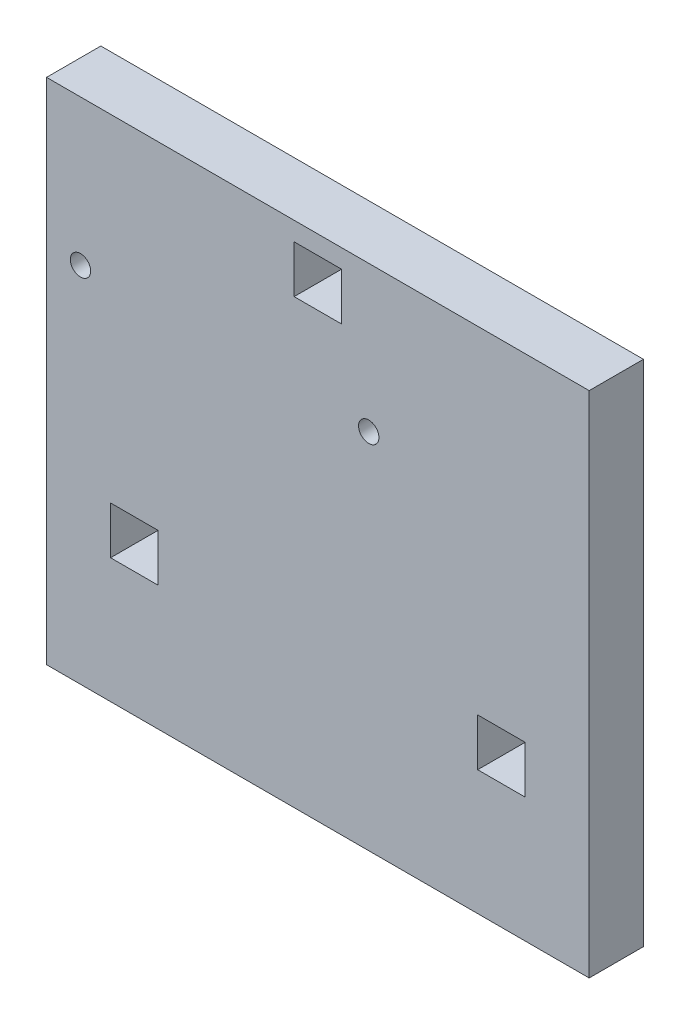
ISO-10303-21;
HEADER;
FILE_DESCRIPTION(('STEP AP214'),'2;1');
FILE_NAME('part.step','',(''),(''),'','','');
FILE_SCHEMA(('AUTOMOTIVE_DESIGN { 1 0 10303 214 1 1 1 1 }'));
ENDSEC;
DATA;
#1=APPLICATION_CONTEXT('core data for automotive mechanical design processes');
#2=APPLICATION_PROTOCOL_DEFINITION('international standard','automotive_design',2000,#1);
#3=PRODUCT_CONTEXT('',#1,'mechanical');
#4=PRODUCT('Part','Part','',(#3));
#5=PRODUCT_RELATED_PRODUCT_CATEGORY('part','',(#4));
#6=PRODUCT_DEFINITION_FORMATION('','',#4);
#7=PRODUCT_DEFINITION_CONTEXT('part definition',#1,'design');
#8=PRODUCT_DEFINITION('design','',#6,#7);
#9=PRODUCT_DEFINITION_SHAPE('','',#8);
#10=(LENGTH_UNIT() NAMED_UNIT(*) SI_UNIT(.MILLI.,.METRE.));
#11=(NAMED_UNIT(*) PLANE_ANGLE_UNIT() SI_UNIT($,.RADIAN.));
#12=(NAMED_UNIT(*) SI_UNIT($,.STERADIAN.) SOLID_ANGLE_UNIT());
#13=UNCERTAINTY_MEASURE_WITH_UNIT(LENGTH_MEASURE(1.E-05),#10,'distance_accuracy_value','');
#14=(GEOMETRIC_REPRESENTATION_CONTEXT(3) GLOBAL_UNCERTAINTY_ASSIGNED_CONTEXT((#13)) GLOBAL_UNIT_ASSIGNED_CONTEXT((#10,
#11,#12)) REPRESENTATION_CONTEXT('',''));
#15=CARTESIAN_POINT('',(0.,0.,0.));
#16=DIRECTION('',(0.,0.,1.));
#17=DIRECTION('',(1.,0.,0.));
#18=AXIS2_PLACEMENT_3D('',#15,#16,#17);
#19=CARTESIAN_POINT('',(0.,0.,16.));
#20=DIRECTION('',(-1.,0.,0.));
#21=DIRECTION('',(0.,-1.,0.));
#22=AXIS2_PLACEMENT_3D('',#19,#20,#21);
#23=PLANE('',#22);
#24=DIRECTION('',(0.,1.,0.));
#25=VECTOR('',#24,1.);
#26=CARTESIAN_POINT('',(0.,0.,0.));
#27=LINE('',#26,#25);
#28=CARTESIAN_POINT('',(0.,-150.,0.));
#29=VERTEX_POINT('',#28);
#30=CARTESIAN_POINT('',(0.,0.,0.));
#31=VERTEX_POINT('',#30);
#32=EDGE_CURVE('E185',#29,#31,#27,.T.);
#33=ORIENTED_EDGE('',*,*,#32,.T.);
#34=DIRECTION('',(0.,0.,-1.));
#35=VECTOR('',#34,1.);
#36=CARTESIAN_POINT('',(0.,0.,16.));
#37=LINE('',#36,#35);
#38=CARTESIAN_POINT('',(0.,0.,16.));
#39=VERTEX_POINT('',#38);
#40=EDGE_CURVE('E11',#39,#31,#37,.T.);
#41=ORIENTED_EDGE('',*,*,#40,.F.);
#42=DIRECTION('',(0.,1.,0.));
#43=VECTOR('',#42,1.);
#44=CARTESIAN_POINT('',(0.,0.,16.));
#45=LINE('',#44,#43);
#46=CARTESIAN_POINT('',(0.,-150.,16.));
#47=VERTEX_POINT('',#46);
#48=EDGE_CURVE('E251',#47,#39,#45,.T.);
#49=ORIENTED_EDGE('',*,*,#48,.F.);
#50=DIRECTION('',(0.,0.,-1.));
#51=VECTOR('',#50,1.);
#52=CARTESIAN_POINT('',(0.,-150.,16.));
#53=LINE('',#52,#51);
#54=EDGE_CURVE('E261',#47,#29,#53,.T.);
#55=ORIENTED_EDGE('',*,*,#54,.T.);
#56=EDGE_LOOP('',(#33,#41,#49,#55));
#57=FACE_BOUND('',#56,.T.);
#58=ADVANCED_FACE('F34',(#57),#23,.F.);
#59=CARTESIAN_POINT('',(0.,0.,16.));
#60=DIRECTION('',(0.,-1.,0.));
#61=DIRECTION('',(0.,0.,-1.));
#62=AXIS2_PLACEMENT_3D('',#59,#60,#61);
#63=PLANE('',#62);
#64=DIRECTION('',(-1.,0.,0.));
#65=VECTOR('',#64,1.);
#66=CARTESIAN_POINT('',(0.,0.,0.));
#67=LINE('',#66,#65);
#68=CARTESIAN_POINT('',(-160.,0.,0.));
#69=VERTEX_POINT('',#68);
#70=EDGE_CURVE('E264',#31,#69,#67,.T.);
#71=ORIENTED_EDGE('',*,*,#70,.T.);
#72=DIRECTION('',(0.,0.,-1.));
#73=VECTOR('',#72,1.);
#74=CARTESIAN_POINT('',(-160.,0.,16.));
#75=LINE('',#74,#73);
#76=CARTESIAN_POINT('',(-160.,0.,16.));
#77=VERTEX_POINT('',#76);
#78=EDGE_CURVE('E41',#77,#69,#75,.T.);
#79=ORIENTED_EDGE('',*,*,#78,.F.);
#80=DIRECTION('',(-1.,0.,0.));
#81=VECTOR('',#80,1.);
#82=CARTESIAN_POINT('',(0.,0.,16.));
#83=LINE('',#82,#81);
#84=EDGE_CURVE('E254',#39,#77,#83,.T.);
#85=ORIENTED_EDGE('',*,*,#84,.F.);
#86=ORIENTED_EDGE('',*,*,#40,.T.);
#87=EDGE_LOOP('',(#71,#79,#85,#86));
#88=FACE_BOUND('',#87,.T.);
#89=ADVANCED_FACE('F294',(#88),#63,.F.);
#90=CARTESIAN_POINT('',(-160.,0.,16.));
#91=DIRECTION('',(1.,0.,0.));
#92=DIRECTION('',(0.,1.,0.));
#93=AXIS2_PLACEMENT_3D('',#90,#91,#92);
#94=PLANE('',#93);
#95=DIRECTION('',(0.,-1.,0.));
#96=VECTOR('',#95,1.);
#97=CARTESIAN_POINT('',(-160.,0.,0.));
#98=LINE('',#97,#96);
#99=CARTESIAN_POINT('',(-160.,-150.,0.));
#100=VERTEX_POINT('',#99);
#101=EDGE_CURVE('E266',#69,#100,#98,.T.);
#102=ORIENTED_EDGE('',*,*,#101,.T.);
#103=DIRECTION('',(0.,0.,-1.));
#104=VECTOR('',#103,1.);
#105=CARTESIAN_POINT('',(-160.,-150.,16.));
#106=LINE('',#105,#104);
#107=CARTESIAN_POINT('',(-160.,-150.,16.));
#108=VERTEX_POINT('',#107);
#109=EDGE_CURVE('E271',#108,#100,#106,.T.);
#110=ORIENTED_EDGE('',*,*,#109,.F.);
#111=DIRECTION('',(0.,-1.,0.));
#112=VECTOR('',#111,1.);
#113=CARTESIAN_POINT('',(-160.,0.,16.));
#114=LINE('',#113,#112);
#115=EDGE_CURVE('E257',#77,#108,#114,.T.);
#116=ORIENTED_EDGE('',*,*,#115,.F.);
#117=ORIENTED_EDGE('',*,*,#78,.T.);
#118=EDGE_LOOP('',(#102,#110,#116,#117));
#119=FACE_BOUND('',#118,.T.);
#120=ADVANCED_FACE('F278',(#119),#94,.F.);
#121=CARTESIAN_POINT('',(0.,-150.,16.));
#122=DIRECTION('',(0.,1.,0.));
#123=DIRECTION('',(-1.,0.,0.));
#124=AXIS2_PLACEMENT_3D('',#121,#122,#123);
#125=PLANE('',#124);
#126=DIRECTION('',(1.,0.,0.));
#127=VECTOR('',#126,1.);
#128=CARTESIAN_POINT('',(0.,-150.,0.));
#129=LINE('',#128,#127);
#130=EDGE_CURVE('E255',#100,#29,#129,.T.);
#131=ORIENTED_EDGE('',*,*,#130,.T.);
#132=ORIENTED_EDGE('',*,*,#54,.F.);
#133=DIRECTION('',(1.,0.,0.));
#134=VECTOR('',#133,1.);
#135=CARTESIAN_POINT('',(0.,-150.,16.));
#136=LINE('',#135,#134);
#137=EDGE_CURVE('E259',#108,#47,#136,.T.);
#138=ORIENTED_EDGE('',*,*,#137,.F.);
#139=ORIENTED_EDGE('',*,*,#109,.T.);
#140=EDGE_LOOP('',(#131,#132,#138,#139));
#141=FACE_BOUND('',#140,.T.);
#142=ADVANCED_FACE('F287',(#141),#125,.F.);
#143=CARTESIAN_POINT('',(0.,0.,16.));
#144=DIRECTION('',(0.,0.,-1.));
#145=DIRECTION('',(-1.,0.,0.));
#146=AXIS2_PLACEMENT_3D('',#143,#144,#145);
#147=PLANE('',#146);
#148=CARTESIAN_POINT('',(-65.,-43.,16.));
#149=DIRECTION('',(0.,0.,1.));
#150=DIRECTION('',(1.,0.,0.));
#151=AXIS2_PLACEMENT_3D('',#148,#149,#150);
#152=CIRCLE('',#151,3.);
#153=CARTESIAN_POINT('',(-62.,-43.,16.));
#154=VERTEX_POINT('',#153);
#155=EDGE_CURVE('E377',#154,#154,#152,.T.);
#156=ORIENTED_EDGE('',*,*,#155,.F.);
#157=EDGE_LOOP('',(#156));
#158=FACE_BOUND('',#157,.T.);
#159=CARTESIAN_POINT('',(-150.,-43.,16.));
#160=DIRECTION('',(0.,0.,1.));
#161=DIRECTION('',(1.,0.,0.));
#162=AXIS2_PLACEMENT_3D('',#159,#160,#161);
#163=CIRCLE('',#162,2.99999999999999);
#164=CARTESIAN_POINT('',(-147.,-43.,16.));
#165=VERTEX_POINT('',#164);
#166=EDGE_CURVE('E172',#165,#165,#163,.T.);
#167=ORIENTED_EDGE('',*,*,#166,.F.);
#168=EDGE_LOOP('',(#167));
#169=FACE_BOUND('',#168,.T.);
#170=DIRECTION('',(1.,0.,0.));
#171=VECTOR('',#170,1.);
#172=CARTESIAN_POINT('',(-73.,-19.5,16.));
#173=LINE('',#172,#171);
#174=CARTESIAN_POINT('',(-87.,-19.5,16.));
#175=VERTEX_POINT('',#174);
#176=CARTESIAN_POINT('',(-73.,-19.5,16.));
#177=VERTEX_POINT('',#176);
#178=EDGE_CURVE('E178',#175,#177,#173,.T.);
#179=ORIENTED_EDGE('',*,*,#178,.F.);
#180=DIRECTION('',(0.,-1.,0.));
#181=VECTOR('',#180,1.);
#182=CARTESIAN_POINT('',(-87.,-5.50000000000002,16.));
#183=LINE('',#182,#181);
#184=CARTESIAN_POINT('',(-87.,-5.50000000000002,16.));
#185=VERTEX_POINT('',#184);
#186=EDGE_CURVE('E48',#185,#175,#183,.T.);
#187=ORIENTED_EDGE('',*,*,#186,.F.);
#188=DIRECTION('',(-1.,0.,0.));
#189=VECTOR('',#188,1.);
#190=CARTESIAN_POINT('',(-73.,-5.50000000000002,16.));
#191=LINE('',#190,#189);
#192=CARTESIAN_POINT('',(-73.,-5.50000000000002,16.));
#193=VERTEX_POINT('',#192);
#194=EDGE_CURVE('E166',#193,#185,#191,.T.);
#195=ORIENTED_EDGE('',*,*,#194,.F.);
#196=DIRECTION('',(0.,1.,0.));
#197=VECTOR('',#196,1.);
#198=CARTESIAN_POINT('',(-73.,-5.50000000000002,16.));
#199=LINE('',#198,#197);
#200=EDGE_CURVE('E169',#177,#193,#199,.T.);
#201=ORIENTED_EDGE('',*,*,#200,.F.);
#202=EDGE_LOOP('',(#179,#187,#195,#201));
#203=FACE_BOUND('',#202,.T.);
#204=DIRECTION('',(1.,0.,0.));
#205=VECTOR('',#204,1.);
#206=CARTESIAN_POINT('',(-127.126587736527,-113.25,16.));
#207=LINE('',#206,#205);
#208=CARTESIAN_POINT('',(-141.126587736527,-113.25,16.));
#209=VERTEX_POINT('',#208);
#210=CARTESIAN_POINT('',(-127.126587736527,-113.25,16.));
#211=VERTEX_POINT('',#210);
#212=EDGE_CURVE('E204',#209,#211,#207,.T.);
#213=ORIENTED_EDGE('',*,*,#212,.F.);
#214=DIRECTION('',(0.,-1.,0.));
#215=VECTOR('',#214,1.);
#216=CARTESIAN_POINT('',(-141.126587736527,-113.25,16.));
#217=LINE('',#216,#215);
#218=CARTESIAN_POINT('',(-141.126587736527,-99.25,16.));
#219=VERTEX_POINT('',#218);
#220=EDGE_CURVE('E56',#219,#209,#217,.T.);
#221=ORIENTED_EDGE('',*,*,#220,.F.);
#222=DIRECTION('',(-1.,0.,0.));
#223=VECTOR('',#222,1.);
#224=CARTESIAN_POINT('',(-127.126587736527,-99.25,16.));
#225=LINE('',#224,#223);
#226=CARTESIAN_POINT('',(-127.126587736527,-99.25,16.));
#227=VERTEX_POINT('',#226);
#228=EDGE_CURVE('E193',#227,#219,#225,.T.);
#229=ORIENTED_EDGE('',*,*,#228,.F.);
#230=DIRECTION('',(0.,1.,0.));
#231=VECTOR('',#230,1.);
#232=CARTESIAN_POINT('',(-127.126587736527,-113.25,16.));
#233=LINE('',#232,#231);
#234=EDGE_CURVE('E208',#211,#227,#233,.T.);
#235=ORIENTED_EDGE('',*,*,#234,.F.);
#236=EDGE_LOOP('',(#213,#221,#229,#235));
#237=FACE_BOUND('',#236,.T.);
#238=DIRECTION('',(1.,0.,0.));
#239=VECTOR('',#238,1.);
#240=CARTESIAN_POINT('',(-18.8734122634726,-113.25,16.));
#241=LINE('',#240,#239);
#242=CARTESIAN_POINT('',(-32.8734122634726,-113.25,16.));
#243=VERTEX_POINT('',#242);
#244=CARTESIAN_POINT('',(-18.8734122634726,-113.25,16.));
#245=VERTEX_POINT('',#244);
#246=EDGE_CURVE('E235',#243,#245,#241,.T.);
#247=ORIENTED_EDGE('',*,*,#246,.F.);
#248=DIRECTION('',(0.,-1.,0.));
#249=VECTOR('',#248,1.);
#250=CARTESIAN_POINT('',(-32.8734122634726,-113.25,16.));
#251=LINE('',#250,#249);
#252=CARTESIAN_POINT('',(-32.8734122634726,-99.25,16.));
#253=VERTEX_POINT('',#252);
#254=EDGE_CURVE('E233',#253,#243,#251,.T.);
#255=ORIENTED_EDGE('',*,*,#254,.F.);
#256=DIRECTION('',(-1.,0.,0.));
#257=VECTOR('',#256,1.);
#258=CARTESIAN_POINT('',(-18.8734122634726,-99.25,16.));
#259=LINE('',#258,#257);
#260=CARTESIAN_POINT('',(-18.8734122634726,-99.25,16.));
#261=VERTEX_POINT('',#260);
#262=EDGE_CURVE('E223',#261,#253,#259,.T.);
#263=ORIENTED_EDGE('',*,*,#262,.F.);
#264=DIRECTION('',(0.,1.,0.));
#265=VECTOR('',#264,1.);
#266=CARTESIAN_POINT('',(-18.8734122634726,-113.25,16.));
#267=LINE('',#266,#265);
#268=EDGE_CURVE('E239',#245,#261,#267,.T.);
#269=ORIENTED_EDGE('',*,*,#268,.F.);
#270=EDGE_LOOP('',(#247,#255,#263,#269));
#271=FACE_BOUND('',#270,.T.);
#272=ORIENTED_EDGE('',*,*,#48,.T.);
#273=ORIENTED_EDGE('',*,*,#84,.T.);
#274=ORIENTED_EDGE('',*,*,#115,.T.);
#275=ORIENTED_EDGE('',*,*,#137,.T.);
#276=EDGE_LOOP('',(#272,#273,#274,#275));
#277=FACE_BOUND('',#276,.T.);
#278=ADVANCED_FACE('F293',(#158,#169,#203,#237,#271,#277),#147,.F.);
#279=CARTESIAN_POINT('',(0.,0.,0.));
#280=DIRECTION('',(0.,0.,-1.));
#281=DIRECTION('',(-1.,0.,0.));
#282=AXIS2_PLACEMENT_3D('',#279,#280,#281);
#283=PLANE('',#282);
#284=CARTESIAN_POINT('',(-65.,-43.,0.));
#285=DIRECTION('',(0.,0.,1.));
#286=DIRECTION('',(1.,0.,0.));
#287=AXIS2_PLACEMENT_3D('',#284,#285,#286);
#288=CIRCLE('',#287,3.);
#289=CARTESIAN_POINT('',(-62.,-43.,0.));
#290=VERTEX_POINT('',#289);
#291=EDGE_CURVE('E236',#290,#290,#288,.T.);
#292=ORIENTED_EDGE('',*,*,#291,.T.);
#293=EDGE_LOOP('',(#292));
#294=FACE_BOUND('',#293,.T.);
#295=CARTESIAN_POINT('',(-150.,-43.,0.));
#296=DIRECTION('',(0.,0.,1.));
#297=DIRECTION('',(1.,0.,0.));
#298=AXIS2_PLACEMENT_3D('',#295,#296,#297);
#299=CIRCLE('',#298,2.99999999999999);
#300=CARTESIAN_POINT('',(-147.,-43.,0.));
#301=VERTEX_POINT('',#300);
#302=EDGE_CURVE('E378',#301,#301,#299,.T.);
#303=ORIENTED_EDGE('',*,*,#302,.T.);
#304=EDGE_LOOP('',(#303));
#305=FACE_BOUND('',#304,.T.);
#306=ORIENTED_EDGE('',*,*,#32,.F.);
#307=ORIENTED_EDGE('',*,*,#130,.F.);
#308=ORIENTED_EDGE('',*,*,#101,.F.);
#309=ORIENTED_EDGE('',*,*,#70,.F.);
#310=EDGE_LOOP('',(#306,#307,#308,#309));
#311=FACE_BOUND('',#310,.T.);
#312=ADVANCED_FACE('F284',(#294,#305,#311),#283,.T.);
#313=CARTESIAN_POINT('',(-32.8734122634726,-113.25,2.));
#314=DIRECTION('',(-1.,0.,0.));
#315=DIRECTION('',(0.,0.,1.));
#316=AXIS2_PLACEMENT_3D('',#313,#314,#315);
#317=PLANE('',#316);
#318=ORIENTED_EDGE('',*,*,#254,.T.);
#319=DIRECTION('',(0.,0.,1.));
#320=VECTOR('',#319,1.);
#321=CARTESIAN_POINT('',(-32.8734122634726,-113.25,2.));
#322=LINE('',#321,#320);
#323=CARTESIAN_POINT('',(-32.8734122634726,-113.25,2.));
#324=VERTEX_POINT('',#323);
#325=EDGE_CURVE('E232',#324,#243,#322,.T.);
#326=ORIENTED_EDGE('',*,*,#325,.F.);
#327=DIRECTION('',(0.,-1.,0.));
#328=VECTOR('',#327,1.);
#329=CARTESIAN_POINT('',(-32.8734122634726,-113.25,2.));
#330=LINE('',#329,#328);
#331=CARTESIAN_POINT('',(-32.8734122634726,-99.25,2.));
#332=VERTEX_POINT('',#331);
#333=EDGE_CURVE('E219',#332,#324,#330,.T.);
#334=ORIENTED_EDGE('',*,*,#333,.F.);
#335=DIRECTION('',(0.,0.,1.));
#336=VECTOR('',#335,1.);
#337=CARTESIAN_POINT('',(-32.8734122634726,-99.25,2.));
#338=LINE('',#337,#336);
#339=EDGE_CURVE('E205',#332,#253,#338,.T.);
#340=ORIENTED_EDGE('',*,*,#339,.T.);
#341=EDGE_LOOP('',(#318,#326,#334,#340));
#342=FACE_BOUND('',#341,.T.);
#343=ADVANCED_FACE('F306',(#342),#317,.F.);
#344=CARTESIAN_POINT('',(-18.8734122634726,-99.25,2.));
#345=DIRECTION('',(0.,1.,0.));
#346=DIRECTION('',(0.,0.,1.));
#347=AXIS2_PLACEMENT_3D('',#344,#345,#346);
#348=PLANE('',#347);
#349=ORIENTED_EDGE('',*,*,#262,.T.);
#350=ORIENTED_EDGE('',*,*,#339,.F.);
#351=DIRECTION('',(-1.,0.,0.));
#352=VECTOR('',#351,1.);
#353=CARTESIAN_POINT('',(-18.8734122634726,-99.25,2.));
#354=LINE('',#353,#352);
#355=CARTESIAN_POINT('',(-18.8734122634726,-99.25,2.));
#356=VERTEX_POINT('',#355);
#357=EDGE_CURVE('E229',#356,#332,#354,.T.);
#358=ORIENTED_EDGE('',*,*,#357,.F.);
#359=DIRECTION('',(0.,0.,1.));
#360=VECTOR('',#359,1.);
#361=CARTESIAN_POINT('',(-18.8734122634726,-99.25,2.));
#362=LINE('',#361,#360);
#363=EDGE_CURVE('E245',#356,#261,#362,.T.);
#364=ORIENTED_EDGE('',*,*,#363,.T.);
#365=EDGE_LOOP('',(#349,#350,#358,#364));
#366=FACE_BOUND('',#365,.T.);
#367=ADVANCED_FACE('F313',(#366),#348,.F.);
#368=CARTESIAN_POINT('',(-18.8734122634726,-113.25,2.));
#369=DIRECTION('',(1.,0.,0.));
#370=DIRECTION('',(0.,0.,-1.));
#371=AXIS2_PLACEMENT_3D('',#368,#369,#370);
#372=PLANE('',#371);
#373=ORIENTED_EDGE('',*,*,#268,.T.);
#374=ORIENTED_EDGE('',*,*,#363,.F.);
#375=DIRECTION('',(0.,1.,0.));
#376=VECTOR('',#375,1.);
#377=CARTESIAN_POINT('',(-18.8734122634726,-113.25,2.));
#378=LINE('',#377,#376);
#379=CARTESIAN_POINT('',(-18.8734122634726,-113.25,2.));
#380=VERTEX_POINT('',#379);
#381=EDGE_CURVE('E226',#380,#356,#378,.T.);
#382=ORIENTED_EDGE('',*,*,#381,.F.);
#383=DIRECTION('',(0.,0.,1.));
#384=VECTOR('',#383,1.);
#385=CARTESIAN_POINT('',(-18.8734122634726,-113.25,2.));
#386=LINE('',#385,#384);
#387=EDGE_CURVE('E247',#380,#245,#386,.T.);
#388=ORIENTED_EDGE('',*,*,#387,.T.);
#389=EDGE_LOOP('',(#373,#374,#382,#388));
#390=FACE_BOUND('',#389,.T.);
#391=ADVANCED_FACE('F319',(#390),#372,.F.);
#392=CARTESIAN_POINT('',(-18.8734122634726,-113.25,2.));
#393=DIRECTION('',(0.,-1.,0.));
#394=DIRECTION('',(0.,0.,-1.));
#395=AXIS2_PLACEMENT_3D('',#392,#393,#394);
#396=PLANE('',#395);
#397=ORIENTED_EDGE('',*,*,#246,.T.);
#398=ORIENTED_EDGE('',*,*,#387,.F.);
#399=DIRECTION('',(1.,0.,0.));
#400=VECTOR('',#399,1.);
#401=CARTESIAN_POINT('',(-18.8734122634726,-113.25,2.));
#402=LINE('',#401,#400);
#403=EDGE_CURVE('E222',#324,#380,#402,.T.);
#404=ORIENTED_EDGE('',*,*,#403,.F.);
#405=ORIENTED_EDGE('',*,*,#325,.T.);
#406=EDGE_LOOP('',(#397,#398,#404,#405));
#407=FACE_BOUND('',#406,.T.);
#408=ADVANCED_FACE('F315',(#407),#396,.F.);
#409=CARTESIAN_POINT('',(0.,0.,2.));
#410=DIRECTION('',(0.,0.,1.));
#411=DIRECTION('',(1.,0.,0.));
#412=AXIS2_PLACEMENT_3D('',#409,#410,#411);
#413=PLANE('',#412);
#414=ORIENTED_EDGE('',*,*,#333,.T.);
#415=ORIENTED_EDGE('',*,*,#403,.T.);
#416=ORIENTED_EDGE('',*,*,#381,.T.);
#417=ORIENTED_EDGE('',*,*,#357,.T.);
#418=EDGE_LOOP('',(#414,#415,#416,#417));
#419=FACE_BOUND('',#418,.T.);
#420=ADVANCED_FACE('F318',(#419),#413,.T.);
#421=CARTESIAN_POINT('',(-141.126587736527,-113.25,2.));
#422=DIRECTION('',(-1.,0.,0.));
#423=DIRECTION('',(0.,0.,1.));
#424=AXIS2_PLACEMENT_3D('',#421,#422,#423);
#425=PLANE('',#424);
#426=ORIENTED_EDGE('',*,*,#220,.T.);
#427=DIRECTION('',(0.,0.,1.));
#428=VECTOR('',#427,1.);
#429=CARTESIAN_POINT('',(-141.126587736527,-113.25,2.));
#430=LINE('',#429,#428);
#431=CARTESIAN_POINT('',(-141.126587736527,-113.25,2.));
#432=VERTEX_POINT('',#431);
#433=EDGE_CURVE('E202',#432,#209,#430,.T.);
#434=ORIENTED_EDGE('',*,*,#433,.F.);
#435=DIRECTION('',(0.,-1.,0.));
#436=VECTOR('',#435,1.);
#437=CARTESIAN_POINT('',(-141.126587736527,-113.25,2.));
#438=LINE('',#437,#436);
#439=CARTESIAN_POINT('',(-141.126587736527,-99.25,2.));
#440=VERTEX_POINT('',#439);
#441=EDGE_CURVE('E189',#440,#432,#438,.T.);
#442=ORIENTED_EDGE('',*,*,#441,.F.);
#443=DIRECTION('',(0.,0.,1.));
#444=VECTOR('',#443,1.);
#445=CARTESIAN_POINT('',(-141.126587736527,-99.25,2.));
#446=LINE('',#445,#444);
#447=EDGE_CURVE('E179',#440,#219,#446,.T.);
#448=ORIENTED_EDGE('',*,*,#447,.T.);
#449=EDGE_LOOP('',(#426,#434,#442,#448));
#450=FACE_BOUND('',#449,.T.);
#451=ADVANCED_FACE('F329',(#450),#425,.F.);
#452=CARTESIAN_POINT('',(-127.126587736527,-99.25,2.));
#453=DIRECTION('',(0.,1.,0.));
#454=DIRECTION('',(0.,0.,1.));
#455=AXIS2_PLACEMENT_3D('',#452,#453,#454);
#456=PLANE('',#455);
#457=ORIENTED_EDGE('',*,*,#228,.T.);
#458=ORIENTED_EDGE('',*,*,#447,.F.);
#459=DIRECTION('',(-1.,0.,0.));
#460=VECTOR('',#459,1.);
#461=CARTESIAN_POINT('',(-127.126587736527,-99.25,2.));
#462=LINE('',#461,#460);
#463=CARTESIAN_POINT('',(-127.126587736527,-99.25,2.));
#464=VERTEX_POINT('',#463);
#465=EDGE_CURVE('E199',#464,#440,#462,.T.);
#466=ORIENTED_EDGE('',*,*,#465,.F.);
#467=DIRECTION('',(0.,0.,1.));
#468=VECTOR('',#467,1.);
#469=CARTESIAN_POINT('',(-127.126587736527,-99.25,2.));
#470=LINE('',#469,#468);
#471=EDGE_CURVE('E214',#464,#227,#470,.T.);
#472=ORIENTED_EDGE('',*,*,#471,.T.);
#473=EDGE_LOOP('',(#457,#458,#466,#472));
#474=FACE_BOUND('',#473,.T.);
#475=ADVANCED_FACE('F333',(#474),#456,.F.);
#476=CARTESIAN_POINT('',(-127.126587736527,-113.25,2.));
#477=DIRECTION('',(1.,0.,0.));
#478=DIRECTION('',(0.,0.,-1.));
#479=AXIS2_PLACEMENT_3D('',#476,#477,#478);
#480=PLANE('',#479);
#481=ORIENTED_EDGE('',*,*,#234,.T.);
#482=ORIENTED_EDGE('',*,*,#471,.F.);
#483=DIRECTION('',(0.,1.,0.));
#484=VECTOR('',#483,1.);
#485=CARTESIAN_POINT('',(-127.126587736527,-113.25,2.));
#486=LINE('',#485,#484);
#487=CARTESIAN_POINT('',(-127.126587736527,-113.25,2.));
#488=VERTEX_POINT('',#487);
#489=EDGE_CURVE('E196',#488,#464,#486,.T.);
#490=ORIENTED_EDGE('',*,*,#489,.F.);
#491=DIRECTION('',(0.,0.,1.));
#492=VECTOR('',#491,1.);
#493=CARTESIAN_POINT('',(-127.126587736527,-113.25,2.));
#494=LINE('',#493,#492);
#495=EDGE_CURVE('E216',#488,#211,#494,.T.);
#496=ORIENTED_EDGE('',*,*,#495,.T.);
#497=EDGE_LOOP('',(#481,#482,#490,#496));
#498=FACE_BOUND('',#497,.T.);
#499=ADVANCED_FACE('F338',(#498),#480,.F.);
#500=CARTESIAN_POINT('',(-127.126587736527,-113.25,2.));
#501=DIRECTION('',(0.,-1.,0.));
#502=DIRECTION('',(0.,0.,-1.));
#503=AXIS2_PLACEMENT_3D('',#500,#501,#502);
#504=PLANE('',#503);
#505=ORIENTED_EDGE('',*,*,#212,.T.);
#506=ORIENTED_EDGE('',*,*,#495,.F.);
#507=DIRECTION('',(1.,0.,0.));
#508=VECTOR('',#507,1.);
#509=CARTESIAN_POINT('',(-127.126587736527,-113.25,2.));
#510=LINE('',#509,#508);
#511=EDGE_CURVE('E192',#432,#488,#510,.T.);
#512=ORIENTED_EDGE('',*,*,#511,.F.);
#513=ORIENTED_EDGE('',*,*,#433,.T.);
#514=EDGE_LOOP('',(#505,#506,#512,#513));
#515=FACE_BOUND('',#514,.T.);
#516=ADVANCED_FACE('F334',(#515),#504,.F.);
#517=CARTESIAN_POINT('',(0.,0.,2.));
#518=DIRECTION('',(0.,0.,1.));
#519=DIRECTION('',(1.,0.,0.));
#520=AXIS2_PLACEMENT_3D('',#517,#518,#519);
#521=PLANE('',#520);
#522=ORIENTED_EDGE('',*,*,#441,.T.);
#523=ORIENTED_EDGE('',*,*,#511,.T.);
#524=ORIENTED_EDGE('',*,*,#489,.T.);
#525=ORIENTED_EDGE('',*,*,#465,.T.);
#526=EDGE_LOOP('',(#522,#523,#524,#525));
#527=FACE_BOUND('',#526,.T.);
#528=ADVANCED_FACE('F337',(#527),#521,.T.);
#529=CARTESIAN_POINT('',(-87.,-5.50000000000002,2.));
#530=DIRECTION('',(-1.,0.,0.));
#531=DIRECTION('',(0.,0.,1.));
#532=AXIS2_PLACEMENT_3D('',#529,#530,#531);
#533=PLANE('',#532);
#534=ORIENTED_EDGE('',*,*,#186,.T.);
#535=DIRECTION('',(0.,0.,1.));
#536=VECTOR('',#535,1.);
#537=CARTESIAN_POINT('',(-87.,-19.5,2.));
#538=LINE('',#537,#536);
#539=CARTESIAN_POINT('',(-87.,-19.5,2.));
#540=VERTEX_POINT('',#539);
#541=EDGE_CURVE('E144',#540,#175,#538,.T.);
#542=ORIENTED_EDGE('',*,*,#541,.F.);
#543=DIRECTION('',(0.,-1.,0.));
#544=VECTOR('',#543,1.);
#545=CARTESIAN_POINT('',(-87.,-5.50000000000002,2.));
#546=LINE('',#545,#544);
#547=CARTESIAN_POINT('',(-87.,-5.50000000000002,2.));
#548=VERTEX_POINT('',#547);
#549=EDGE_CURVE('E148',#548,#540,#546,.T.);
#550=ORIENTED_EDGE('',*,*,#549,.F.);
#551=DIRECTION('',(0.,0.,1.));
#552=VECTOR('',#551,1.);
#553=CARTESIAN_POINT('',(-87.,-5.50000000000002,2.));
#554=LINE('',#553,#552);
#555=EDGE_CURVE('E183',#548,#185,#554,.T.);
#556=ORIENTED_EDGE('',*,*,#555,.T.);
#557=EDGE_LOOP('',(#534,#542,#550,#556));
#558=FACE_BOUND('',#557,.T.);
#559=ADVANCED_FACE('F146',(#558),#533,.F.);
#560=CARTESIAN_POINT('',(-73.,-5.50000000000002,2.));
#561=DIRECTION('',(0.,1.,0.));
#562=DIRECTION('',(-1.,0.,0.));
#563=AXIS2_PLACEMENT_3D('',#560,#561,#562);
#564=PLANE('',#563);
#565=ORIENTED_EDGE('',*,*,#194,.T.);
#566=ORIENTED_EDGE('',*,*,#555,.F.);
#567=DIRECTION('',(-1.,0.,0.));
#568=VECTOR('',#567,1.);
#569=CARTESIAN_POINT('',(-73.,-5.50000000000002,2.));
#570=LINE('',#569,#568);
#571=CARTESIAN_POINT('',(-73.,-5.50000000000002,2.));
#572=VERTEX_POINT('',#571);
#573=EDGE_CURVE('E154',#572,#548,#570,.T.);
#574=ORIENTED_EDGE('',*,*,#573,.F.);
#575=DIRECTION('',(0.,0.,1.));
#576=VECTOR('',#575,1.);
#577=CARTESIAN_POINT('',(-73.,-5.50000000000002,2.));
#578=LINE('',#577,#576);
#579=EDGE_CURVE('E186',#572,#193,#578,.T.);
#580=ORIENTED_EDGE('',*,*,#579,.T.);
#581=EDGE_LOOP('',(#565,#566,#574,#580));
#582=FACE_BOUND('',#581,.T.);
#583=ADVANCED_FACE('F351',(#582),#564,.F.);
#584=CARTESIAN_POINT('',(-73.,-5.50000000000002,2.));
#585=DIRECTION('',(1.,0.,0.));
#586=DIRECTION('',(0.,0.,-1.));
#587=AXIS2_PLACEMENT_3D('',#584,#585,#586);
#588=PLANE('',#587);
#589=ORIENTED_EDGE('',*,*,#200,.T.);
#590=ORIENTED_EDGE('',*,*,#579,.F.);
#591=DIRECTION('',(0.,1.,0.));
#592=VECTOR('',#591,1.);
#593=CARTESIAN_POINT('',(-73.,-5.50000000000002,2.));
#594=LINE('',#593,#592);
#595=CARTESIAN_POINT('',(-73.,-19.5,2.));
#596=VERTEX_POINT('',#595);
#597=EDGE_CURVE('E162',#596,#572,#594,.T.);
#598=ORIENTED_EDGE('',*,*,#597,.F.);
#599=DIRECTION('',(0.,0.,1.));
#600=VECTOR('',#599,1.);
#601=CARTESIAN_POINT('',(-73.,-19.5,2.));
#602=LINE('',#601,#600);
#603=EDGE_CURVE('E153',#596,#177,#602,.T.);
#604=ORIENTED_EDGE('',*,*,#603,.T.);
#605=EDGE_LOOP('',(#589,#590,#598,#604));
#606=FACE_BOUND('',#605,.T.);
#607=ADVANCED_FACE('F354',(#606),#588,.F.);
#608=CARTESIAN_POINT('',(-73.,-19.5,2.));
#609=DIRECTION('',(0.,-1.,0.));
#610=DIRECTION('',(0.,0.,-1.));
#611=AXIS2_PLACEMENT_3D('',#608,#609,#610);
#612=PLANE('',#611);
#613=ORIENTED_EDGE('',*,*,#178,.T.);
#614=ORIENTED_EDGE('',*,*,#603,.F.);
#615=DIRECTION('',(1.,0.,0.));
#616=VECTOR('',#615,1.);
#617=CARTESIAN_POINT('',(-73.,-19.5,2.));
#618=LINE('',#617,#616);
#619=EDGE_CURVE('E157',#540,#596,#618,.T.);
#620=ORIENTED_EDGE('',*,*,#619,.F.);
#621=ORIENTED_EDGE('',*,*,#541,.T.);
#622=EDGE_LOOP('',(#613,#614,#620,#621));
#623=FACE_BOUND('',#622,.T.);
#624=ADVANCED_FACE('F158',(#623),#612,.F.);
#625=CARTESIAN_POINT('',(0.,0.,2.));
#626=DIRECTION('',(0.,0.,-1.));
#627=DIRECTION('',(-1.,0.,0.));
#628=AXIS2_PLACEMENT_3D('',#625,#626,#627);
#629=PLANE('',#628);
#630=ORIENTED_EDGE('',*,*,#549,.T.);
#631=ORIENTED_EDGE('',*,*,#619,.T.);
#632=ORIENTED_EDGE('',*,*,#597,.T.);
#633=ORIENTED_EDGE('',*,*,#573,.T.);
#634=EDGE_LOOP('',(#630,#631,#632,#633));
#635=FACE_BOUND('',#634,.T.);
#636=ADVANCED_FACE('F164',(#635),#629,.F.);
#637=CARTESIAN_POINT('',(-150.,-43.,0.));
#638=DIRECTION('',(0.,0.,1.));
#639=DIRECTION('',(1.,0.,0.));
#640=AXIS2_PLACEMENT_3D('',#637,#638,#639);
#641=CYLINDRICAL_SURFACE('',#640,2.99999999999999);
#642=ORIENTED_EDGE('',*,*,#302,.F.);
#643=EDGE_LOOP('',(#642));
#644=FACE_BOUND('',#643,.T.);
#645=ORIENTED_EDGE('',*,*,#166,.T.);
#646=EDGE_LOOP('',(#645));
#647=FACE_BOUND('',#646,.T.);
#648=ADVANCED_FACE('F363',(#644,#647),#641,.F.);
#649=CARTESIAN_POINT('',(-65.,-43.,0.));
#650=DIRECTION('',(0.,0.,1.));
#651=DIRECTION('',(1.,0.,0.));
#652=AXIS2_PLACEMENT_3D('',#649,#650,#651);
#653=CYLINDRICAL_SURFACE('',#652,3.);
#654=ORIENTED_EDGE('',*,*,#291,.F.);
#655=EDGE_LOOP('',(#654));
#656=FACE_BOUND('',#655,.T.);
#657=ORIENTED_EDGE('',*,*,#155,.T.);
#658=EDGE_LOOP('',(#657));
#659=FACE_BOUND('',#658,.T.);
#660=ADVANCED_FACE('F366',(#656,#659),#653,.F.);
#661=CLOSED_SHELL('',(#58,#89,#120,#142,#278,#312,#343,#367,#391,#408,#420,#451,#475,#499,#516,
#528,#559,#583,#607,#624,#636,#648,#660));
#662=MANIFOLD_SOLID_BREP('B2',#661);
#663=ADVANCED_BREP_SHAPE_REPRESENTATION('',(#18,#662),#14);
#664=SHAPE_DEFINITION_REPRESENTATION(#9,#663);
ENDSEC;
END-ISO-10303-21;
